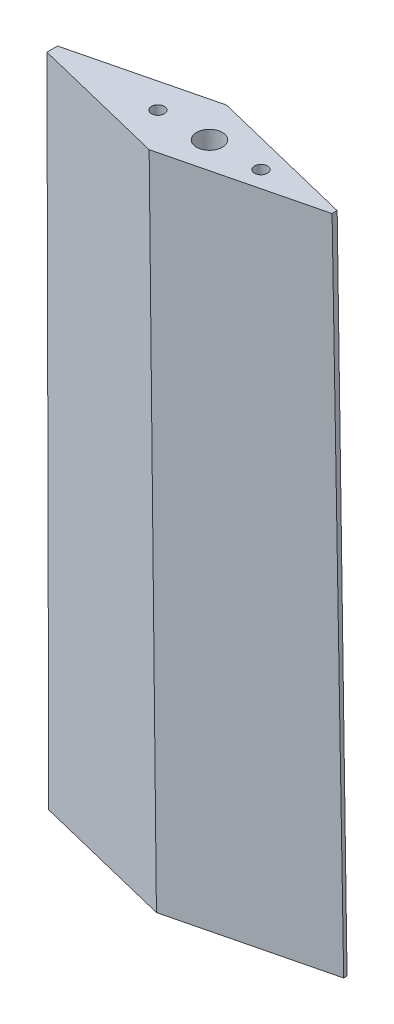
ISO-10303-21;
HEADER;
FILE_DESCRIPTION(('STEP AP214'),'2;1');
FILE_NAME('part.step','',(''),(''),'','','');
FILE_SCHEMA(('AUTOMOTIVE_DESIGN { 1 0 10303 214 1 1 1 1 }'));
ENDSEC;
DATA;
#1=APPLICATION_CONTEXT('core data for automotive mechanical design processes');
#2=APPLICATION_PROTOCOL_DEFINITION('international standard','automotive_design',2000,#1);
#3=PRODUCT_CONTEXT('',#1,'mechanical');
#4=PRODUCT('Part','Part','',(#3));
#5=PRODUCT_RELATED_PRODUCT_CATEGORY('part','',(#4));
#6=PRODUCT_DEFINITION_FORMATION('','',#4);
#7=PRODUCT_DEFINITION_CONTEXT('part definition',#1,'design');
#8=PRODUCT_DEFINITION('design','',#6,#7);
#9=PRODUCT_DEFINITION_SHAPE('','',#8);
#10=(LENGTH_UNIT() NAMED_UNIT(*) SI_UNIT(.MILLI.,.METRE.));
#11=(NAMED_UNIT(*) PLANE_ANGLE_UNIT() SI_UNIT($,.RADIAN.));
#12=(NAMED_UNIT(*) SI_UNIT($,.STERADIAN.) SOLID_ANGLE_UNIT());
#13=UNCERTAINTY_MEASURE_WITH_UNIT(LENGTH_MEASURE(1.E-05),#10,'distance_accuracy_value','');
#14=(GEOMETRIC_REPRESENTATION_CONTEXT(3) GLOBAL_UNCERTAINTY_ASSIGNED_CONTEXT((#13)) GLOBAL_UNIT_ASSIGNED_CONTEXT((#10,
#11,#12)) REPRESENTATION_CONTEXT('',''));
#15=CARTESIAN_POINT('',(0.,0.,0.));
#16=DIRECTION('',(0.,0.,1.));
#17=DIRECTION('',(1.,0.,0.));
#18=AXIS2_PLACEMENT_3D('',#15,#16,#17);
#19=CARTESIAN_POINT('',(49.2246430956603,942.792954579603,0.));
#20=DIRECTION('',(0.238804060374286,0.00264025652948276,0.971064184178478));
#21=DIRECTION('',(0.971067568818316,0.,-0.238804892724763));
#22=AXIS2_PLACEMENT_3D('',#19,#20,#21);
#23=PLANE('',#22);
#24=DIRECTION('',(0.,0.999996303727557,-0.00271892096670104));
#25=VECTOR('',#24,1.);
#26=CARTESIAN_POINT('',(57.2177665065291,807.125541731836,-1.59679821194385));
#27=LINE('',#26,#25);
#28=CARTESIAN_POINT('',(57.2177665065291,539.871914098348,-0.870154034469396));
#29=VERTEX_POINT('',#28);
#30=CARTESIAN_POINT('',(57.2177665065291,701.796914098348,-1.31041693933411));
#31=VERTEX_POINT('',#30);
#32=EDGE_CURVE('E112',#29,#31,#27,.T.);
#33=ORIENTED_EDGE('',*,*,#32,.T.);
#34=DIRECTION('',(0.971067568818316,0.,-0.238804892724763));
#35=VECTOR('',#34,1.);
#36=CARTESIAN_POINT('',(49.3765931175051,701.796914098348,0.617884066826339));
#37=LINE('',#36,#35);
#38=CARTESIAN_POINT('',(90.6212496201301,701.796914098348,-9.52500000000005));
#39=VERTEX_POINT('',#38);
#40=EDGE_CURVE('E104',#31,#39,#37,.T.);
#41=ORIENTED_EDGE('',*,*,#40,.T.);
#42=DIRECTION('',(0.0110554869516549,-0.999938886236685,0.));
#43=VECTOR('',#42,1.);
#44=CARTESIAN_POINT('',(87.9567582020914,942.792954579603,-9.525));
#45=LINE('',#44,#43);
#46=CARTESIAN_POINT('',(92.4115187548612,539.871914098348,-9.525));
#47=VERTEX_POINT('',#46);
#48=EDGE_CURVE('E58',#39,#47,#45,.T.);
#49=ORIENTED_EDGE('',*,*,#48,.T.);
#50=DIRECTION('',(0.971067568818316,0.,-0.238804892724763));
#51=VECTOR('',#50,1.);
#52=CARTESIAN_POINT('',(49.4786881861133,539.871914098348,1.03303975702382));
#53=LINE('',#52,#51);
#54=EDGE_CURVE('E125',#29,#47,#53,.T.);
#55=ORIENTED_EDGE('',*,*,#54,.F.);
#56=EDGE_LOOP('',(#33,#41,#49,#55));
#57=FACE_BOUND('',#56,.T.);
#58=ADVANCED_FACE('F33',(#57),#23,.F.);
#59=CARTESIAN_POINT('',(88.8309804853994,863.721914098348,9.525));
#60=DIRECTION('',(0.238804060374286,0.00264025652948278,-0.971064184178478));
#61=DIRECTION('',(-0.971067568818316,0.,-0.238804892724763));
#62=AXIS2_PLACEMENT_3D('',#59,#60,#61);
#63=PLANE('',#62);
#64=DIRECTION('',(0.0110554869516549,-0.999938886236685,0.));
#65=VECTOR('',#64,1.);
#66=CARTESIAN_POINT('',(88.751463048907,870.914051109623,9.525));
#67=LINE('',#66,#65);
#68=CARTESIAN_POINT('',(90.6212496201303,701.796914098348,9.52500000000001));
#69=VERTEX_POINT('',#68);
#70=CARTESIAN_POINT('',(92.4115187548611,539.871914098348,9.52500000000001));
#71=VERTEX_POINT('',#70);
#72=EDGE_CURVE('E42',#69,#71,#67,.T.);
#73=ORIENTED_EDGE('',*,*,#72,.F.);
#74=DIRECTION('',(-0.971067568818316,0.,-0.238804892724763));
#75=VECTOR('',#74,1.);
#76=CARTESIAN_POINT('',(88.9330755540076,701.796914098348,9.10984430980252));
#77=LINE('',#76,#75);
#78=CARTESIAN_POINT('',(57.2177665065291,701.796914098348,1.31041693933411));
#79=VERTEX_POINT('',#78);
#80=EDGE_CURVE('E88',#69,#79,#77,.T.);
#81=ORIENTED_EDGE('',*,*,#80,.T.);
#82=DIRECTION('',(0.,-0.999996303727557,-0.00271892096670106));
#83=VECTOR('',#82,1.);
#84=CARTESIAN_POINT('',(57.2177665065291,807.073746478871,1.59665738422406));
#85=LINE('',#84,#83);
#86=CARTESIAN_POINT('',(57.2177665065291,539.871914098348,0.870154034469398));
#87=VERTEX_POINT('',#86);
#88=EDGE_CURVE('E110',#79,#87,#85,.T.);
#89=ORIENTED_EDGE('',*,*,#88,.T.);
#90=DIRECTION('',(-0.971067568818316,0.,-0.238804892724763));
#91=VECTOR('',#90,1.);
#92=CARTESIAN_POINT('',(89.0351706226157,539.871914098348,8.69468861960503));
#93=LINE('',#92,#91);
#94=EDGE_CURVE('E109',#71,#87,#93,.T.);
#95=ORIENTED_EDGE('',*,*,#94,.F.);
#96=EDGE_LOOP('',(#73,#81,#89,#95));
#97=FACE_BOUND('',#96,.T.);
#98=ADVANCED_FACE('F107',(#97),#63,.F.);
#99=CARTESIAN_POINT('',(57.2177665065291,807.103985498089,-9.525));
#100=DIRECTION('',(-1.,0.,0.));
#101=DIRECTION('',(0.,0.,1.));
#102=AXIS2_PLACEMENT_3D('',#99,#100,#101);
#103=PLANE('',#102);
#104=DIRECTION('',(0.,0.,1.));
#105=VECTOR('',#104,1.);
#106=CARTESIAN_POINT('',(57.2177665065291,701.796914098348,-9.525));
#107=LINE('',#106,#105);
#108=EDGE_CURVE('E93',#31,#79,#107,.T.);
#109=ORIENTED_EDGE('',*,*,#108,.F.);
#110=ORIENTED_EDGE('',*,*,#32,.F.);
#111=DIRECTION('',(0.,0.,1.));
#112=VECTOR('',#111,1.);
#113=CARTESIAN_POINT('',(57.2177665065291,539.871914098348,-9.525));
#114=LINE('',#113,#112);
#115=EDGE_CURVE('E132',#29,#87,#114,.T.);
#116=ORIENTED_EDGE('',*,*,#115,.T.);
#117=ORIENTED_EDGE('',*,*,#88,.F.);
#118=EDGE_LOOP('',(#109,#110,#116,#117));
#119=FACE_BOUND('',#118,.T.);
#120=ADVANCED_FACE('F35',(#119),#103,.T.);
#121=CARTESIAN_POINT('',(134.681996719391,219.836565958458,-9.525));
#122=DIRECTION('',(0.999866416510167,0.0163446974617832,0.));
#123=DIRECTION('',(-0.0163446974617832,0.999866416510167,0.));
#124=AXIS2_PLACEMENT_3D('',#121,#122,#123);
#125=PLANE('',#124);
#126=DIRECTION('',(0.,0.,-1.));
#127=VECTOR('',#126,1.);
#128=CARTESIAN_POINT('',(126.803448196463,701.796914098348,-9.525));
#129=LINE('',#128,#127);
#130=CARTESIAN_POINT('',(126.803448196463,701.796914098348,0.627075358070428));
#131=VERTEX_POINT('',#130);
#132=CARTESIAN_POINT('',(126.803448196463,701.796914098348,-0.627075358070433));
#133=VERTEX_POINT('',#132);
#134=EDGE_CURVE('E50',#131,#133,#129,.T.);
#135=ORIENTED_EDGE('',*,*,#134,.F.);
#136=DIRECTION('',(-0.0163446836309879,0.999865570428571,0.00130091834944232));
#137=VECTOR('',#136,1.);
#138=CARTESIAN_POINT('',(134.682199250408,219.824176376929,-1.61200009608092E-05));
#139=LINE('',#138,#137);
#140=CARTESIAN_POINT('',(129.450416924282,539.871914098348,0.416395832778686));
#141=VERTEX_POINT('',#140);
#142=EDGE_CURVE('E11',#141,#131,#139,.T.);
#143=ORIENTED_EDGE('',*,*,#142,.F.);
#144=DIRECTION('',(0.,0.,-1.));
#145=VECTOR('',#144,1.);
#146=CARTESIAN_POINT('',(129.450416924282,539.871914098348,-9.525));
#147=LINE('',#146,#145);
#148=CARTESIAN_POINT('',(129.450416924282,539.871914098348,-0.416395832778693));
#149=VERTEX_POINT('',#148);
#150=EDGE_CURVE('E120',#141,#149,#147,.T.);
#151=ORIENTED_EDGE('',*,*,#150,.T.);
#152=DIRECTION('',(0.0163446836309879,-0.999865570428571,0.00130091834944232));
#153=VECTOR('',#152,1.);
#154=CARTESIAN_POINT('',(134.681794188375,219.848955539986,-1.61200009590745E-05));
#155=LINE('',#154,#153);
#156=EDGE_CURVE('E137',#133,#149,#155,.T.);
#157=ORIENTED_EDGE('',*,*,#156,.F.);
#158=EDGE_LOOP('',(#135,#143,#151,#157));
#159=FACE_BOUND('',#158,.T.);
#160=ADVANCED_FACE('F209',(#159),#125,.T.);
#161=CARTESIAN_POINT('',(88.751463048907,870.914051109623,9.525));
#162=DIRECTION('',(-0.238804060374287,-0.00264025652948276,-0.971064184178478));
#163=DIRECTION('',(-0.971067568818316,0.,0.238804892724763));
#164=AXIS2_PLACEMENT_3D('',#161,#162,#163);
#165=PLANE('',#164);
#166=ORIENTED_EDGE('',*,*,#142,.T.);
#167=DIRECTION('',(-0.971067568818316,0.,0.238804892724763));
#168=VECTOR('',#167,1.);
#169=CARTESIAN_POINT('',(88.8580928201343,701.796914098348,9.95859544072959));
#170=LINE('',#169,#168);
#171=EDGE_CURVE('E91',#131,#69,#170,.T.);
#172=ORIENTED_EDGE('',*,*,#171,.T.);
#173=ORIENTED_EDGE('',*,*,#72,.T.);
#174=DIRECTION('',(-0.971067568818316,0.,0.238804892724763));
#175=VECTOR('',#174,1.);
#176=CARTESIAN_POINT('',(88.9601878887425,539.871914098348,10.3737511309271));
#177=LINE('',#176,#175);
#178=EDGE_CURVE('E130',#141,#71,#177,.T.);
#179=ORIENTED_EDGE('',*,*,#178,.F.);
#180=EDGE_LOOP('',(#166,#172,#173,#179));
#181=FACE_BOUND('',#180,.T.);
#182=ADVANCED_FACE('F100',(#181),#165,.F.);
#183=CARTESIAN_POINT('',(87.9567582020914,942.792954579603,-9.525));
#184=DIRECTION('',(-0.238804060374286,-0.00264025652948276,0.971064184178478));
#185=DIRECTION('',(0.971067568818316,0.,0.238804892724763));
#186=AXIS2_PLACEMENT_3D('',#183,#184,#185);
#187=PLANE('',#186);
#188=ORIENTED_EDGE('',*,*,#48,.F.);
#189=DIRECTION('',(0.971067568818316,0.,0.238804892724763));
#190=VECTOR('',#189,1.);
#191=CARTESIAN_POINT('',(88.1087082239363,701.796914098348,-10.1428840668263));
#192=LINE('',#191,#190);
#193=EDGE_CURVE('E144',#39,#133,#192,.T.);
#194=ORIENTED_EDGE('',*,*,#193,.T.);
#195=ORIENTED_EDGE('',*,*,#156,.T.);
#196=DIRECTION('',(0.971067568818316,0.,0.238804892724763));
#197=VECTOR('',#196,1.);
#198=CARTESIAN_POINT('',(88.2108032925445,539.871914098348,-10.5580397570238));
#199=LINE('',#198,#197);
#200=EDGE_CURVE('E116',#47,#149,#199,.T.);
#201=ORIENTED_EDGE('',*,*,#200,.F.);
#202=EDGE_LOOP('',(#188,#194,#195,#201));
#203=FACE_BOUND('',#202,.T.);
#204=ADVANCED_FACE('F197',(#203),#187,.F.);
#205=CARTESIAN_POINT('',(0.,539.871914098348,-9.52500000000005));
#206=DIRECTION('',(0.,-1.,0.));
#207=DIRECTION('',(0.,0.,-1.));
#208=AXIS2_PLACEMENT_3D('',#205,#206,#207);
#209=PLANE('',#208);
#210=CARTESIAN_POINT('',(108.64988161296,539.871914098348,0.));
#211=DIRECTION('',(0.,-1.,0.));
#212=DIRECTION('',(0.,0.,-1.));
#213=AXIS2_PLACEMENT_3D('',#210,#211,#212);
#214=CIRCLE('',#213,1.5875);
#215=CARTESIAN_POINT('',(108.64988161296,539.871914098348,-1.5875));
#216=VERTEX_POINT('',#215);
#217=EDGE_CURVE('E153',#216,#216,#214,.T.);
#218=ORIENTED_EDGE('',*,*,#217,.F.);
#219=EDGE_LOOP('',(#218));
#220=FACE_BOUND('',#219,.T.);
#221=CARTESIAN_POINT('',(83.2498816129603,539.871914098348,0.));
#222=DIRECTION('',(0.,-1.,0.));
#223=DIRECTION('',(0.,0.,-1.));
#224=AXIS2_PLACEMENT_3D('',#221,#222,#223);
#225=CIRCLE('',#224,1.5875);
#226=CARTESIAN_POINT('',(83.2498816129603,539.871914098348,-1.5875));
#227=VERTEX_POINT('',#226);
#228=EDGE_CURVE('E146',#227,#227,#225,.T.);
#229=ORIENTED_EDGE('',*,*,#228,.F.);
#230=EDGE_LOOP('',(#229));
#231=FACE_BOUND('',#230,.T.);
#232=CARTESIAN_POINT('',(95.9498816129603,539.871914098348,0.));
#233=DIRECTION('',(0.,-1.,0.));
#234=DIRECTION('',(0.,0.,-1.));
#235=AXIS2_PLACEMENT_3D('',#232,#233,#234);
#236=CIRCLE('',#235,3.175);
#237=CARTESIAN_POINT('',(95.9498816129603,539.871914098348,-3.175));
#238=VERTEX_POINT('',#237);
#239=EDGE_CURVE('E97',#238,#238,#236,.F.);
#240=ORIENTED_EDGE('',*,*,#239,.T.);
#241=EDGE_LOOP('',(#240));
#242=FACE_BOUND('',#241,.T.);
#243=ORIENTED_EDGE('',*,*,#94,.T.);
#244=ORIENTED_EDGE('',*,*,#115,.F.);
#245=ORIENTED_EDGE('',*,*,#54,.T.);
#246=ORIENTED_EDGE('',*,*,#200,.T.);
#247=ORIENTED_EDGE('',*,*,#150,.F.);
#248=ORIENTED_EDGE('',*,*,#178,.T.);
#249=EDGE_LOOP('',(#243,#244,#245,#246,#247,#248));
#250=FACE_BOUND('',#249,.T.);
#251=ADVANCED_FACE('F192',(#220,#231,#242,#250),#209,.T.);
#252=CARTESIAN_POINT('',(95.9498816129603,778.636565958458,0.));
#253=DIRECTION('',(0.,-1.,0.));
#254=DIRECTION('',(0.,0.,-1.));
#255=AXIS2_PLACEMENT_3D('',#252,#253,#254);
#256=CYLINDRICAL_SURFACE('',#255,3.175);
#257=CARTESIAN_POINT('',(95.9498816129603,701.796914098348,0.));
#258=DIRECTION('',(0.,-1.,0.));
#259=DIRECTION('',(0.,0.,-1.));
#260=AXIS2_PLACEMENT_3D('',#257,#258,#259);
#261=CIRCLE('',#260,3.175);
#262=CARTESIAN_POINT('',(95.9498816129603,701.796914098348,-3.175));
#263=VERTEX_POINT('',#262);
#264=EDGE_CURVE('E37',#263,#263,#261,.F.);
#265=ORIENTED_EDGE('',*,*,#264,.T.);
#266=EDGE_LOOP('',(#265));
#267=FACE_BOUND('',#266,.T.);
#268=ORIENTED_EDGE('',*,*,#239,.F.);
#269=EDGE_LOOP('',(#268));
#270=FACE_BOUND('',#269,.T.);
#271=ADVANCED_FACE('F183',(#267,#270),#256,.F.);
#272=CARTESIAN_POINT('',(0.,701.796914098348,-9.52500000000005));
#273=DIRECTION('',(0.,-1.,0.));
#274=DIRECTION('',(0.,0.,-1.));
#275=AXIS2_PLACEMENT_3D('',#272,#273,#274);
#276=PLANE('',#275);
#277=CARTESIAN_POINT('',(108.64988161296,701.796914098348,0.));
#278=DIRECTION('',(0.,1.,0.));
#279=DIRECTION('',(0.,0.,1.));
#280=AXIS2_PLACEMENT_3D('',#277,#278,#279);
#281=CIRCLE('',#280,1.5875);
#282=CARTESIAN_POINT('',(108.64988161296,701.796914098348,1.5875));
#283=VERTEX_POINT('',#282);
#284=EDGE_CURVE('E165',#283,#283,#281,.T.);
#285=ORIENTED_EDGE('',*,*,#284,.F.);
#286=EDGE_LOOP('',(#285));
#287=FACE_BOUND('',#286,.T.);
#288=CARTESIAN_POINT('',(83.2498816129603,701.796914098348,0.));
#289=DIRECTION('',(0.,1.,0.));
#290=DIRECTION('',(0.,0.,1.));
#291=AXIS2_PLACEMENT_3D('',#288,#289,#290);
#292=CIRCLE('',#291,1.5875);
#293=CARTESIAN_POINT('',(83.2498816129603,701.796914098348,1.5875));
#294=VERTEX_POINT('',#293);
#295=EDGE_CURVE('E159',#294,#294,#292,.T.);
#296=ORIENTED_EDGE('',*,*,#295,.F.);
#297=EDGE_LOOP('',(#296));
#298=FACE_BOUND('',#297,.T.);
#299=ORIENTED_EDGE('',*,*,#264,.F.);
#300=EDGE_LOOP('',(#299));
#301=FACE_BOUND('',#300,.T.);
#302=ORIENTED_EDGE('',*,*,#171,.F.);
#303=ORIENTED_EDGE('',*,*,#134,.T.);
#304=ORIENTED_EDGE('',*,*,#193,.F.);
#305=ORIENTED_EDGE('',*,*,#40,.F.);
#306=ORIENTED_EDGE('',*,*,#108,.T.);
#307=ORIENTED_EDGE('',*,*,#80,.F.);
#308=EDGE_LOOP('',(#302,#303,#304,#305,#306,#307));
#309=FACE_BOUND('',#308,.T.);
#310=ADVANCED_FACE('F90',(#287,#298,#301,#309),#276,.F.);
#311=CARTESIAN_POINT('',(83.2498816129603,552.571914098348,0.));
#312=DIRECTION('',(0.,-1.,0.));
#313=DIRECTION('',(0.,0.,-1.));
#314=AXIS2_PLACEMENT_3D('',#311,#312,#313);
#315=CYLINDRICAL_SURFACE('',#314,1.5875);
#316=CARTESIAN_POINT('',(83.2498816129603,552.571914098348,0.));
#317=DIRECTION('',(0.,-1.,0.));
#318=DIRECTION('',(0.,0.,-1.));
#319=AXIS2_PLACEMENT_3D('',#316,#317,#318);
#320=CIRCLE('',#319,1.5875);
#321=CARTESIAN_POINT('',(83.2498816129603,552.571914098348,-1.5875));
#322=VERTEX_POINT('',#321);
#323=EDGE_CURVE('E149',#322,#322,#320,.T.);
#324=ORIENTED_EDGE('',*,*,#323,.F.);
#325=EDGE_LOOP('',(#324));
#326=FACE_BOUND('',#325,.T.);
#327=ORIENTED_EDGE('',*,*,#228,.T.);
#328=EDGE_LOOP('',(#327));
#329=FACE_BOUND('',#328,.T.);
#330=ADVANCED_FACE('F182',(#326,#329),#315,.F.);
#331=CARTESIAN_POINT('',(83.2498816129603,552.571914098348,0.));
#332=DIRECTION('',(0.,-1.,0.));
#333=DIRECTION('',(0.,0.,-1.));
#334=AXIS2_PLACEMENT_3D('',#331,#332,#333);
#335=PLANE('',#334);
#336=ORIENTED_EDGE('',*,*,#323,.T.);
#337=EDGE_LOOP('',(#336));
#338=FACE_BOUND('',#337,.T.);
#339=ADVANCED_FACE('F242',(#338),#335,.T.);
#340=CARTESIAN_POINT('',(108.64988161296,552.571914098348,0.));
#341=DIRECTION('',(0.,-1.,0.));
#342=DIRECTION('',(0.,0.,-1.));
#343=AXIS2_PLACEMENT_3D('',#340,#341,#342);
#344=CYLINDRICAL_SURFACE('',#343,1.5875);
#345=CARTESIAN_POINT('',(108.64988161296,552.571914098348,0.));
#346=DIRECTION('',(0.,-1.,0.));
#347=DIRECTION('',(0.,0.,-1.));
#348=AXIS2_PLACEMENT_3D('',#345,#346,#347);
#349=CIRCLE('',#348,1.5875);
#350=CARTESIAN_POINT('',(108.64988161296,552.571914098348,-1.5875));
#351=VERTEX_POINT('',#350);
#352=EDGE_CURVE('E150',#351,#351,#349,.T.);
#353=ORIENTED_EDGE('',*,*,#352,.F.);
#354=EDGE_LOOP('',(#353));
#355=FACE_BOUND('',#354,.T.);
#356=ORIENTED_EDGE('',*,*,#217,.T.);
#357=EDGE_LOOP('',(#356));
#358=FACE_BOUND('',#357,.T.);
#359=ADVANCED_FACE('F252',(#355,#358),#344,.F.);
#360=CARTESIAN_POINT('',(108.64988161296,552.571914098348,0.));
#361=DIRECTION('',(0.,-1.,0.));
#362=DIRECTION('',(0.,0.,-1.));
#363=AXIS2_PLACEMENT_3D('',#360,#361,#362);
#364=PLANE('',#363);
#365=ORIENTED_EDGE('',*,*,#352,.T.);
#366=EDGE_LOOP('',(#365));
#367=FACE_BOUND('',#366,.T.);
#368=ADVANCED_FACE('F262',(#367),#364,.T.);
#369=CARTESIAN_POINT('',(83.2498816129603,689.096914098348,0.));
#370=DIRECTION('',(0.,1.,0.));
#371=DIRECTION('',(0.,0.,1.));
#372=AXIS2_PLACEMENT_3D('',#369,#370,#371);
#373=CYLINDRICAL_SURFACE('',#372,1.5875);
#374=CARTESIAN_POINT('',(83.2498816129603,689.096914098348,0.));
#375=DIRECTION('',(0.,1.,0.));
#376=DIRECTION('',(0.,0.,1.));
#377=AXIS2_PLACEMENT_3D('',#374,#375,#376);
#378=CIRCLE('',#377,1.5875);
#379=CARTESIAN_POINT('',(83.2498816129603,689.096914098348,1.5875));
#380=VERTEX_POINT('',#379);
#381=EDGE_CURVE('E156',#380,#380,#378,.T.);
#382=ORIENTED_EDGE('',*,*,#381,.F.);
#383=EDGE_LOOP('',(#382));
#384=FACE_BOUND('',#383,.T.);
#385=ORIENTED_EDGE('',*,*,#295,.T.);
#386=EDGE_LOOP('',(#385));
#387=FACE_BOUND('',#386,.T.);
#388=ADVANCED_FACE('F272',(#384,#387),#373,.F.);
#389=CARTESIAN_POINT('',(83.2498816129603,689.096914098348,0.));
#390=DIRECTION('',(0.,1.,0.));
#391=DIRECTION('',(0.,0.,1.));
#392=AXIS2_PLACEMENT_3D('',#389,#390,#391);
#393=PLANE('',#392);
#394=ORIENTED_EDGE('',*,*,#381,.T.);
#395=EDGE_LOOP('',(#394));
#396=FACE_BOUND('',#395,.T.);
#397=ADVANCED_FACE('F176',(#396),#393,.T.);
#398=CARTESIAN_POINT('',(108.64988161296,689.096914098348,0.));
#399=DIRECTION('',(0.,1.,0.));
#400=DIRECTION('',(0.,0.,1.));
#401=AXIS2_PLACEMENT_3D('',#398,#399,#400);
#402=CYLINDRICAL_SURFACE('',#401,1.5875);
#403=CARTESIAN_POINT('',(108.64988161296,689.096914098348,0.));
#404=DIRECTION('',(0.,1.,0.));
#405=DIRECTION('',(0.,0.,1.));
#406=AXIS2_PLACEMENT_3D('',#403,#404,#405);
#407=CIRCLE('',#406,1.5875);
#408=CARTESIAN_POINT('',(108.64988161296,689.096914098348,1.5875));
#409=VERTEX_POINT('',#408);
#410=EDGE_CURVE('E162',#409,#409,#407,.T.);
#411=ORIENTED_EDGE('',*,*,#410,.F.);
#412=EDGE_LOOP('',(#411));
#413=FACE_BOUND('',#412,.T.);
#414=ORIENTED_EDGE('',*,*,#284,.T.);
#415=EDGE_LOOP('',(#414));
#416=FACE_BOUND('',#415,.T.);
#417=ADVANCED_FACE('F173',(#413,#416),#402,.F.);
#418=CARTESIAN_POINT('',(108.64988161296,689.096914098348,0.));
#419=DIRECTION('',(0.,1.,0.));
#420=DIRECTION('',(0.,0.,1.));
#421=AXIS2_PLACEMENT_3D('',#418,#419,#420);
#422=PLANE('',#421);
#423=ORIENTED_EDGE('',*,*,#410,.T.);
#424=EDGE_LOOP('',(#423));
#425=FACE_BOUND('',#424,.T.);
#426=ADVANCED_FACE('F171',(#425),#422,.T.);
#427=CLOSED_SHELL('',(#58,#98,#120,#160,#182,#204,#251,#271,#310,#330,#339,#359,#368,#388,#397,
#417,#426));
#428=MANIFOLD_SOLID_BREP('B2',#427);
#429=ADVANCED_BREP_SHAPE_REPRESENTATION('',(#18,#428),#14);
#430=SHAPE_DEFINITION_REPRESENTATION(#9,#429);
ENDSEC;
END-ISO-10303-21;
